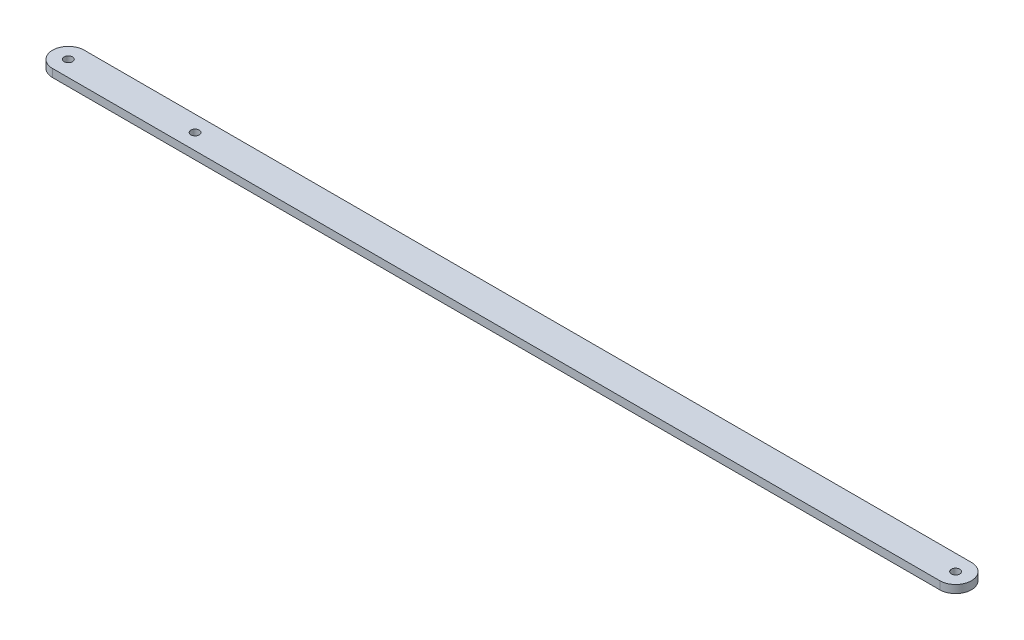
ISO-10303-21;
HEADER;
FILE_DESCRIPTION(('STEP AP214'),'2;1');
FILE_NAME('part.step','',(''),(''),'','','');
FILE_SCHEMA(('AUTOMOTIVE_DESIGN { 1 0 10303 214 1 1 1 1 }'));
ENDSEC;
DATA;
#1=APPLICATION_CONTEXT('core data for automotive mechanical design processes');
#2=APPLICATION_PROTOCOL_DEFINITION('international standard','automotive_design',2000,#1);
#3=PRODUCT_CONTEXT('',#1,'mechanical');
#4=PRODUCT('Part','Part','',(#3));
#5=PRODUCT_RELATED_PRODUCT_CATEGORY('part','',(#4));
#6=PRODUCT_DEFINITION_FORMATION('','',#4);
#7=PRODUCT_DEFINITION_CONTEXT('part definition',#1,'design');
#8=PRODUCT_DEFINITION('design','',#6,#7);
#9=PRODUCT_DEFINITION_SHAPE('','',#8);
#10=(LENGTH_UNIT() NAMED_UNIT(*) SI_UNIT(.MILLI.,.METRE.));
#11=(NAMED_UNIT(*) PLANE_ANGLE_UNIT() SI_UNIT($,.RADIAN.));
#12=(NAMED_UNIT(*) SI_UNIT($,.STERADIAN.) SOLID_ANGLE_UNIT());
#13=UNCERTAINTY_MEASURE_WITH_UNIT(LENGTH_MEASURE(1.E-05),#10,'distance_accuracy_value','');
#14=(GEOMETRIC_REPRESENTATION_CONTEXT(3) GLOBAL_UNCERTAINTY_ASSIGNED_CONTEXT((#13)) GLOBAL_UNIT_ASSIGNED_CONTEXT((#10,
#11,#12)) REPRESENTATION_CONTEXT('',''));
#15=CARTESIAN_POINT('',(0.,0.,0.));
#16=DIRECTION('',(0.,0.,1.));
#17=DIRECTION('',(1.,0.,0.));
#18=AXIS2_PLACEMENT_3D('',#15,#16,#17);
#19=CARTESIAN_POINT('',(-355.6,6.35,0.));
#20=DIRECTION('',(0.,1.,0.));
#21=DIRECTION('',(0.,0.,1.));
#22=AXIS2_PLACEMENT_3D('',#19,#20,#21);
#23=PLANE('',#22);
#24=CARTESIAN_POINT('',(-254.,6.35,0.));
#25=DIRECTION('',(0.,1.,0.));
#26=DIRECTION('',(0.,0.,1.));
#27=AXIS2_PLACEMENT_3D('',#24,#25,#26);
#28=CIRCLE('',#27,3.36550000000002);
#29=CARTESIAN_POINT('',(-254.,6.35,3.36550000000002));
#30=VERTEX_POINT('',#29);
#31=EDGE_CURVE('E134',#30,#30,#28,.T.);
#32=ORIENTED_EDGE('',*,*,#31,.F.);
#33=EDGE_LOOP('',(#32));
#34=FACE_BOUND('',#33,.T.);
#35=CARTESIAN_POINT('',(-355.6,6.35,0.));
#36=DIRECTION('',(0.,1.,0.));
#37=DIRECTION('',(0.,0.,1.));
#38=AXIS2_PLACEMENT_3D('',#35,#36,#37);
#39=CIRCLE('',#38,12.7);
#40=CARTESIAN_POINT('',(-355.6,6.35,-12.7000000000001));
#41=VERTEX_POINT('',#40);
#42=CARTESIAN_POINT('',(-355.6,6.35,12.6999999999999));
#43=VERTEX_POINT('',#42);
#44=EDGE_CURVE('E92',#41,#43,#39,.T.);
#45=ORIENTED_EDGE('',*,*,#44,.T.);
#46=DIRECTION('',(1.,0.,0.));
#47=VECTOR('',#46,1.);
#48=CARTESIAN_POINT('',(-355.6,6.35,12.6999999999999));
#49=LINE('',#48,#47);
#50=CARTESIAN_POINT('',(355.6,6.35,12.7));
#51=VERTEX_POINT('',#50);
#52=EDGE_CURVE('E87',#43,#51,#49,.T.);
#53=ORIENTED_EDGE('',*,*,#52,.T.);
#54=CARTESIAN_POINT('',(355.6,6.35,0.));
#55=DIRECTION('',(0.,1.,0.));
#56=DIRECTION('',(0.,0.,1.));
#57=AXIS2_PLACEMENT_3D('',#54,#55,#56);
#58=CIRCLE('',#57,12.7);
#59=CARTESIAN_POINT('',(355.6,6.35,-12.7000000000001));
#60=VERTEX_POINT('',#59);
#61=EDGE_CURVE('E90',#51,#60,#58,.T.);
#62=ORIENTED_EDGE('',*,*,#61,.T.);
#63=DIRECTION('',(-1.,0.,0.));
#64=VECTOR('',#63,1.);
#65=CARTESIAN_POINT('',(-355.6,6.35,-12.7000000000001));
#66=LINE('',#65,#64);
#67=EDGE_CURVE('E57',#60,#41,#66,.T.);
#68=ORIENTED_EDGE('',*,*,#67,.T.);
#69=EDGE_LOOP('',(#45,#53,#62,#68));
#70=FACE_BOUND('',#69,.T.);
#71=CARTESIAN_POINT('',(355.6,6.35,0.));
#72=DIRECTION('',(0.,1.,0.));
#73=DIRECTION('',(0.,0.,1.));
#74=AXIS2_PLACEMENT_3D('',#71,#72,#73);
#75=CIRCLE('',#74,3.36550000000002);
#76=CARTESIAN_POINT('',(355.6,6.35,3.36550000000002));
#77=VERTEX_POINT('',#76);
#78=EDGE_CURVE('E112',#77,#77,#75,.T.);
#79=ORIENTED_EDGE('',*,*,#78,.F.);
#80=EDGE_LOOP('',(#79));
#81=FACE_BOUND('',#80,.T.);
#82=CARTESIAN_POINT('',(-355.6,6.35,0.));
#83=DIRECTION('',(0.,1.,0.));
#84=DIRECTION('',(0.,0.,1.));
#85=AXIS2_PLACEMENT_3D('',#82,#83,#84);
#86=CIRCLE('',#85,3.36550000000002);
#87=CARTESIAN_POINT('',(-355.6,6.35,3.36550000000002));
#88=VERTEX_POINT('',#87);
#89=EDGE_CURVE('E142',#88,#88,#86,.T.);
#90=ORIENTED_EDGE('',*,*,#89,.F.);
#91=EDGE_LOOP('',(#90));
#92=FACE_BOUND('',#91,.T.);
#93=ADVANCED_FACE('F39',(#34,#70,#81,#92),#23,.T.);
#94=CARTESIAN_POINT('',(-355.6,0.,0.));
#95=DIRECTION('',(0.,1.,0.));
#96=DIRECTION('',(0.,0.,1.));
#97=AXIS2_PLACEMENT_3D('',#94,#95,#96);
#98=PLANE('',#97);
#99=CARTESIAN_POINT('',(-355.6,0.,0.));
#100=DIRECTION('',(0.,1.,0.));
#101=DIRECTION('',(0.,0.,1.));
#102=AXIS2_PLACEMENT_3D('',#99,#100,#101);
#103=CIRCLE('',#102,12.7);
#104=CARTESIAN_POINT('',(-355.6,0.,-12.7000000000001));
#105=VERTEX_POINT('',#104);
#106=CARTESIAN_POINT('',(-355.6,0.,12.6999999999999));
#107=VERTEX_POINT('',#106);
#108=EDGE_CURVE('E108',#105,#107,#103,.T.);
#109=ORIENTED_EDGE('',*,*,#108,.F.);
#110=DIRECTION('',(-1.,0.,0.));
#111=VECTOR('',#110,1.);
#112=CARTESIAN_POINT('',(-355.6,0.,-12.7000000000001));
#113=LINE('',#112,#111);
#114=CARTESIAN_POINT('',(355.6,0.,-12.7000000000001));
#115=VERTEX_POINT('',#114);
#116=EDGE_CURVE('E80',#115,#105,#113,.T.);
#117=ORIENTED_EDGE('',*,*,#116,.F.);
#118=CARTESIAN_POINT('',(355.6,0.,0.));
#119=DIRECTION('',(0.,1.,0.));
#120=DIRECTION('',(0.,0.,1.));
#121=AXIS2_PLACEMENT_3D('',#118,#119,#120);
#122=CIRCLE('',#121,12.7);
#123=CARTESIAN_POINT('',(355.6,0.,12.7));
#124=VERTEX_POINT('',#123);
#125=EDGE_CURVE('E74',#124,#115,#122,.T.);
#126=ORIENTED_EDGE('',*,*,#125,.F.);
#127=DIRECTION('',(1.,0.,0.));
#128=VECTOR('',#127,1.);
#129=CARTESIAN_POINT('',(-355.6,0.,12.6999999999999));
#130=LINE('',#129,#128);
#131=EDGE_CURVE('E97',#107,#124,#130,.T.);
#132=ORIENTED_EDGE('',*,*,#131,.F.);
#133=EDGE_LOOP('',(#109,#117,#126,#132));
#134=FACE_BOUND('',#133,.T.);
#135=CARTESIAN_POINT('',(355.6,0.,0.));
#136=DIRECTION('',(0.,1.,0.));
#137=DIRECTION('',(0.,0.,1.));
#138=AXIS2_PLACEMENT_3D('',#135,#136,#137);
#139=CIRCLE('',#138,3.36550000000002);
#140=CARTESIAN_POINT('',(355.6,0.,3.36550000000002));
#141=VERTEX_POINT('',#140);
#142=EDGE_CURVE('E130',#141,#141,#139,.T.);
#143=ORIENTED_EDGE('',*,*,#142,.T.);
#144=EDGE_LOOP('',(#143));
#145=FACE_BOUND('',#144,.T.);
#146=CARTESIAN_POINT('',(-254.,0.,0.));
#147=DIRECTION('',(0.,1.,0.));
#148=DIRECTION('',(0.,0.,1.));
#149=AXIS2_PLACEMENT_3D('',#146,#147,#148);
#150=CIRCLE('',#149,3.36550000000002);
#151=CARTESIAN_POINT('',(-254.,0.,3.36550000000002));
#152=VERTEX_POINT('',#151);
#153=EDGE_CURVE('E138',#152,#152,#150,.T.);
#154=ORIENTED_EDGE('',*,*,#153,.T.);
#155=EDGE_LOOP('',(#154));
#156=FACE_BOUND('',#155,.T.);
#157=CARTESIAN_POINT('',(-355.6,0.,0.));
#158=DIRECTION('',(0.,1.,0.));
#159=DIRECTION('',(0.,0.,1.));
#160=AXIS2_PLACEMENT_3D('',#157,#158,#159);
#161=CIRCLE('',#160,3.36550000000002);
#162=CARTESIAN_POINT('',(-355.6,0.,3.36550000000002));
#163=VERTEX_POINT('',#162);
#164=EDGE_CURVE('E146',#163,#163,#161,.T.);
#165=ORIENTED_EDGE('',*,*,#164,.T.);
#166=EDGE_LOOP('',(#165));
#167=FACE_BOUND('',#166,.T.);
#168=ADVANCED_FACE('F125',(#134,#145,#156,#167),#98,.F.);
#169=CARTESIAN_POINT('',(-355.6,6.35,0.));
#170=DIRECTION('',(0.,-1.,0.));
#171=DIRECTION('',(0.,0.,-1.));
#172=AXIS2_PLACEMENT_3D('',#169,#170,#171);
#173=CYLINDRICAL_SURFACE('',#172,12.7);
#174=ORIENTED_EDGE('',*,*,#108,.T.);
#175=DIRECTION('',(0.,-1.,0.));
#176=VECTOR('',#175,1.);
#177=CARTESIAN_POINT('',(-355.6,6.35,12.6999999999999));
#178=LINE('',#177,#176);
#179=EDGE_CURVE('E11',#43,#107,#178,.T.);
#180=ORIENTED_EDGE('',*,*,#179,.F.);
#181=ORIENTED_EDGE('',*,*,#44,.F.);
#182=DIRECTION('',(0.,-1.,0.));
#183=VECTOR('',#182,1.);
#184=CARTESIAN_POINT('',(-355.6,6.35,-12.7000000000001));
#185=LINE('',#184,#183);
#186=EDGE_CURVE('E104',#41,#105,#185,.T.);
#187=ORIENTED_EDGE('',*,*,#186,.T.);
#188=EDGE_LOOP('',(#174,#180,#181,#187));
#189=FACE_BOUND('',#188,.T.);
#190=ADVANCED_FACE('F41',(#189),#173,.T.);
#191=CARTESIAN_POINT('',(-355.6,6.35,12.6999999999999));
#192=DIRECTION('',(0.,0.,-1.));
#193=DIRECTION('',(-1.,0.,0.));
#194=AXIS2_PLACEMENT_3D('',#191,#192,#193);
#195=PLANE('',#194);
#196=ORIENTED_EDGE('',*,*,#131,.T.);
#197=DIRECTION('',(0.,-1.,0.));
#198=VECTOR('',#197,1.);
#199=CARTESIAN_POINT('',(355.6,6.35,12.7));
#200=LINE('',#199,#198);
#201=EDGE_CURVE('E49',#51,#124,#200,.T.);
#202=ORIENTED_EDGE('',*,*,#201,.F.);
#203=ORIENTED_EDGE('',*,*,#52,.F.);
#204=ORIENTED_EDGE('',*,*,#179,.T.);
#205=EDGE_LOOP('',(#196,#202,#203,#204));
#206=FACE_BOUND('',#205,.T.);
#207=ADVANCED_FACE('F96',(#206),#195,.F.);
#208=CARTESIAN_POINT('',(355.6,6.35,0.));
#209=DIRECTION('',(0.,-1.,0.));
#210=DIRECTION('',(0.,0.,-1.));
#211=AXIS2_PLACEMENT_3D('',#208,#209,#210);
#212=CYLINDRICAL_SURFACE('',#211,12.7);
#213=ORIENTED_EDGE('',*,*,#125,.T.);
#214=DIRECTION('',(0.,-1.,0.));
#215=VECTOR('',#214,1.);
#216=CARTESIAN_POINT('',(355.6,6.35,-12.7000000000001));
#217=LINE('',#216,#215);
#218=EDGE_CURVE('E99',#60,#115,#217,.T.);
#219=ORIENTED_EDGE('',*,*,#218,.F.);
#220=ORIENTED_EDGE('',*,*,#61,.F.);
#221=ORIENTED_EDGE('',*,*,#201,.T.);
#222=EDGE_LOOP('',(#213,#219,#220,#221));
#223=FACE_BOUND('',#222,.T.);
#224=ADVANCED_FACE('F100',(#223),#212,.T.);
#225=CARTESIAN_POINT('',(-355.6,6.35,-12.7000000000001));
#226=DIRECTION('',(0.,0.,1.));
#227=DIRECTION('',(1.,0.,0.));
#228=AXIS2_PLACEMENT_3D('',#225,#226,#227);
#229=PLANE('',#228);
#230=ORIENTED_EDGE('',*,*,#116,.T.);
#231=ORIENTED_EDGE('',*,*,#186,.F.);
#232=ORIENTED_EDGE('',*,*,#67,.F.);
#233=ORIENTED_EDGE('',*,*,#218,.T.);
#234=EDGE_LOOP('',(#230,#231,#232,#233));
#235=FACE_BOUND('',#234,.T.);
#236=ADVANCED_FACE('F122',(#235),#229,.F.);
#237=CARTESIAN_POINT('',(355.6,6.35,0.));
#238=DIRECTION('',(0.,-1.,0.));
#239=DIRECTION('',(0.,0.,-1.));
#240=AXIS2_PLACEMENT_3D('',#237,#238,#239);
#241=CYLINDRICAL_SURFACE('',#240,3.36550000000002);
#242=ORIENTED_EDGE('',*,*,#78,.T.);
#243=EDGE_LOOP('',(#242));
#244=FACE_BOUND('',#243,.T.);
#245=ORIENTED_EDGE('',*,*,#142,.F.);
#246=EDGE_LOOP('',(#245));
#247=FACE_BOUND('',#246,.T.);
#248=ADVANCED_FACE('F166',(#244,#247),#241,.F.);
#249=CARTESIAN_POINT('',(-254.,6.35,0.));
#250=DIRECTION('',(0.,-1.,0.));
#251=DIRECTION('',(0.,0.,-1.));
#252=AXIS2_PLACEMENT_3D('',#249,#250,#251);
#253=CYLINDRICAL_SURFACE('',#252,3.36550000000002);
#254=ORIENTED_EDGE('',*,*,#31,.T.);
#255=EDGE_LOOP('',(#254));
#256=FACE_BOUND('',#255,.T.);
#257=ORIENTED_EDGE('',*,*,#153,.F.);
#258=EDGE_LOOP('',(#257));
#259=FACE_BOUND('',#258,.T.);
#260=ADVANCED_FACE('F212',(#256,#259),#253,.F.);
#261=CARTESIAN_POINT('',(-355.6,6.35,0.));
#262=DIRECTION('',(0.,-1.,0.));
#263=DIRECTION('',(0.,0.,-1.));
#264=AXIS2_PLACEMENT_3D('',#261,#262,#263);
#265=CYLINDRICAL_SURFACE('',#264,3.36550000000002);
#266=ORIENTED_EDGE('',*,*,#89,.T.);
#267=EDGE_LOOP('',(#266));
#268=FACE_BOUND('',#267,.T.);
#269=ORIENTED_EDGE('',*,*,#164,.F.);
#270=EDGE_LOOP('',(#269));
#271=FACE_BOUND('',#270,.T.);
#272=ADVANCED_FACE('F154',(#268,#271),#265,.F.);
#273=CLOSED_SHELL('',(#93,#168,#190,#207,#224,#236,#248,#260,#272));
#274=MANIFOLD_SOLID_BREP('B2',#273);
#275=ADVANCED_BREP_SHAPE_REPRESENTATION('',(#18,#274),#14);
#276=SHAPE_DEFINITION_REPRESENTATION(#9,#275);
ENDSEC;
END-ISO-10303-21;
